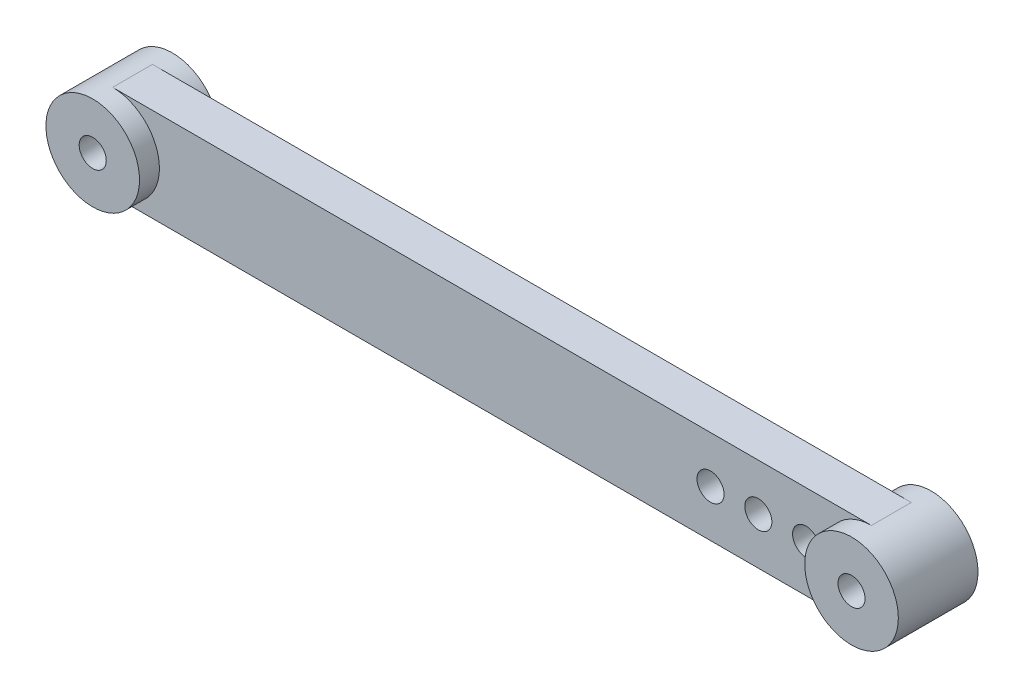
ISO-10303-21;
HEADER;
FILE_DESCRIPTION(('STEP AP214'),'2;1');
FILE_NAME('part.step','',(''),(''),'','','');
FILE_SCHEMA(('AUTOMOTIVE_DESIGN { 1 0 10303 214 1 1 1 1 }'));
ENDSEC;
DATA;
#1=APPLICATION_CONTEXT('core data for automotive mechanical design processes');
#2=APPLICATION_PROTOCOL_DEFINITION('international standard','automotive_design',2000,#1);
#3=PRODUCT_CONTEXT('',#1,'mechanical');
#4=PRODUCT('Part','Part','',(#3));
#5=PRODUCT_RELATED_PRODUCT_CATEGORY('part','',(#4));
#6=PRODUCT_DEFINITION_FORMATION('','',#4);
#7=PRODUCT_DEFINITION_CONTEXT('part definition',#1,'design');
#8=PRODUCT_DEFINITION('design','',#6,#7);
#9=PRODUCT_DEFINITION_SHAPE('','',#8);
#10=(LENGTH_UNIT() NAMED_UNIT(*) SI_UNIT(.MILLI.,.METRE.));
#11=(NAMED_UNIT(*) PLANE_ANGLE_UNIT() SI_UNIT($,.RADIAN.));
#12=(NAMED_UNIT(*) SI_UNIT($,.STERADIAN.) SOLID_ANGLE_UNIT());
#13=UNCERTAINTY_MEASURE_WITH_UNIT(LENGTH_MEASURE(1.E-05),#10,'distance_accuracy_value','');
#14=(GEOMETRIC_REPRESENTATION_CONTEXT(3) GLOBAL_UNCERTAINTY_ASSIGNED_CONTEXT((#13)) GLOBAL_UNIT_ASSIGNED_CONTEXT((#10,
#11,#12)) REPRESENTATION_CONTEXT('',''));
#15=CARTESIAN_POINT('',(0.,0.,0.));
#16=DIRECTION('',(0.,0.,1.));
#17=DIRECTION('',(1.,0.,0.));
#18=AXIS2_PLACEMENT_3D('',#15,#16,#17);
#19=CARTESIAN_POINT('',(-47.625,0.,2.5));
#20=DIRECTION('',(0.,0.,1.));
#21=DIRECTION('',(1.,0.,0.));
#22=AXIS2_PLACEMENT_3D('',#19,#20,#21);
#23=PLANE('',#22);
#24=CARTESIAN_POINT('',(39.425,0.,2.5));
#25=DIRECTION('',(0.,0.,1.));
#26=DIRECTION('',(1.,0.,0.));
#27=AXIS2_PLACEMENT_3D('',#24,#25,#26);
#28=CIRCLE('',#27,1.7);
#29=CARTESIAN_POINT('',(41.125,0.,2.5));
#30=VERTEX_POINT('',#29);
#31=EDGE_CURVE('E134',#30,#30,#28,.T.);
#32=ORIENTED_EDGE('',*,*,#31,.F.);
#33=EDGE_LOOP('',(#32));
#34=FACE_BOUND('',#33,.T.);
#35=CARTESIAN_POINT('',(27.425,0.,2.5));
#36=DIRECTION('',(0.,0.,1.));
#37=DIRECTION('',(1.,0.,0.));
#38=AXIS2_PLACEMENT_3D('',#35,#36,#37);
#39=CIRCLE('',#38,1.7);
#40=CARTESIAN_POINT('',(29.125,0.,2.5));
#41=VERTEX_POINT('',#40);
#42=EDGE_CURVE('E122',#41,#41,#39,.T.);
#43=ORIENTED_EDGE('',*,*,#42,.F.);
#44=EDGE_LOOP('',(#43));
#45=FACE_BOUND('',#44,.T.);
#46=CARTESIAN_POINT('',(33.425,0.,2.5));
#47=DIRECTION('',(0.,0.,1.));
#48=DIRECTION('',(1.,0.,0.));
#49=AXIS2_PLACEMENT_3D('',#46,#47,#48);
#50=CIRCLE('',#49,1.7);
#51=CARTESIAN_POINT('',(35.125,0.,2.5));
#52=VERTEX_POINT('',#51);
#53=EDGE_CURVE('E118',#52,#52,#50,.T.);
#54=ORIENTED_EDGE('',*,*,#53,.F.);
#55=EDGE_LOOP('',(#54));
#56=FACE_BOUND('',#55,.T.);
#57=DIRECTION('',(1.,0.,0.));
#58=VECTOR('',#57,1.);
#59=CARTESIAN_POINT('',(-47.625,-5.875,2.5));
#60=LINE('',#59,#58);
#61=CARTESIAN_POINT('',(-47.625,-5.875,2.5));
#62=VERTEX_POINT('',#61);
#63=CARTESIAN_POINT('',(47.625,-5.87499999999998,2.5));
#64=VERTEX_POINT('',#63);
#65=EDGE_CURVE('E58',#62,#64,#60,.T.);
#66=ORIENTED_EDGE('',*,*,#65,.T.);
#67=CARTESIAN_POINT('',(47.625,0.,2.5));
#68=DIRECTION('',(0.,0.,1.));
#69=DIRECTION('',(1.,0.,0.));
#70=AXIS2_PLACEMENT_3D('',#67,#68,#69);
#71=CIRCLE('',#70,5.875);
#72=CARTESIAN_POINT('',(47.625,5.87500000000002,2.5));
#73=VERTEX_POINT('',#72);
#74=EDGE_CURVE('E102',#64,#73,#71,.F.);
#75=ORIENTED_EDGE('',*,*,#74,.T.);
#76=DIRECTION('',(-1.,0.,0.));
#77=VECTOR('',#76,1.);
#78=CARTESIAN_POINT('',(-47.625,5.875,2.5));
#79=LINE('',#78,#77);
#80=CARTESIAN_POINT('',(-47.625,5.875,2.5));
#81=VERTEX_POINT('',#80);
#82=EDGE_CURVE('E176',#73,#81,#79,.T.);
#83=ORIENTED_EDGE('',*,*,#82,.T.);
#84=CARTESIAN_POINT('',(-47.625,0.,2.5));
#85=DIRECTION('',(0.,0.,1.));
#86=DIRECTION('',(1.,0.,0.));
#87=AXIS2_PLACEMENT_3D('',#84,#85,#86);
#88=CIRCLE('',#87,5.875);
#89=EDGE_CURVE('E75',#81,#62,#88,.F.);
#90=ORIENTED_EDGE('',*,*,#89,.T.);
#91=EDGE_LOOP('',(#66,#75,#83,#90));
#92=FACE_BOUND('',#91,.T.);
#93=ADVANCED_FACE('F38',(#34,#45,#56,#92),#23,.T.);
#94=CARTESIAN_POINT('',(-47.625,0.,-2.5));
#95=DIRECTION('',(0.,0.,1.));
#96=DIRECTION('',(1.,0.,0.));
#97=AXIS2_PLACEMENT_3D('',#94,#95,#96);
#98=PLANE('',#97);
#99=CARTESIAN_POINT('',(39.425,0.,-2.5));
#100=DIRECTION('',(0.,0.,1.));
#101=DIRECTION('',(1.,0.,0.));
#102=AXIS2_PLACEMENT_3D('',#99,#100,#101);
#103=CIRCLE('',#102,1.7);
#104=CARTESIAN_POINT('',(41.125,0.,-2.5));
#105=VERTEX_POINT('',#104);
#106=EDGE_CURVE('E42',#105,#105,#103,.T.);
#107=ORIENTED_EDGE('',*,*,#106,.T.);
#108=EDGE_LOOP('',(#107));
#109=FACE_BOUND('',#108,.T.);
#110=CARTESIAN_POINT('',(27.425,0.,-2.5));
#111=DIRECTION('',(0.,0.,1.));
#112=DIRECTION('',(1.,0.,0.));
#113=AXIS2_PLACEMENT_3D('',#110,#111,#112);
#114=CIRCLE('',#113,1.7);
#115=CARTESIAN_POINT('',(29.125,0.,-2.5));
#116=VERTEX_POINT('',#115);
#117=EDGE_CURVE('E119',#116,#116,#114,.T.);
#118=ORIENTED_EDGE('',*,*,#117,.T.);
#119=EDGE_LOOP('',(#118));
#120=FACE_BOUND('',#119,.T.);
#121=CARTESIAN_POINT('',(33.425,0.,-2.5));
#122=DIRECTION('',(0.,0.,1.));
#123=DIRECTION('',(1.,0.,0.));
#124=AXIS2_PLACEMENT_3D('',#121,#122,#123);
#125=CIRCLE('',#124,1.7);
#126=CARTESIAN_POINT('',(35.125,0.,-2.5));
#127=VERTEX_POINT('',#126);
#128=EDGE_CURVE('E115',#127,#127,#125,.T.);
#129=ORIENTED_EDGE('',*,*,#128,.T.);
#130=EDGE_LOOP('',(#129));
#131=FACE_BOUND('',#130,.T.);
#132=CARTESIAN_POINT('',(47.625,0.,-2.5));
#133=DIRECTION('',(0.,0.,1.));
#134=DIRECTION('',(1.,0.,0.));
#135=AXIS2_PLACEMENT_3D('',#132,#133,#134);
#136=CIRCLE('',#135,5.875);
#137=CARTESIAN_POINT('',(47.625,-5.87499999999998,-2.5));
#138=VERTEX_POINT('',#137);
#139=CARTESIAN_POINT('',(47.625,5.87500000000002,-2.5));
#140=VERTEX_POINT('',#139);
#141=EDGE_CURVE('E11',#138,#140,#136,.F.);
#142=ORIENTED_EDGE('',*,*,#141,.F.);
#143=DIRECTION('',(1.,0.,0.));
#144=VECTOR('',#143,1.);
#145=CARTESIAN_POINT('',(-47.625,-5.875,-2.5));
#146=LINE('',#145,#144);
#147=CARTESIAN_POINT('',(-47.625,-5.875,-2.5));
#148=VERTEX_POINT('',#147);
#149=EDGE_CURVE('E89',#148,#138,#146,.T.);
#150=ORIENTED_EDGE('',*,*,#149,.F.);
#151=CARTESIAN_POINT('',(-47.625,0.,-2.5));
#152=DIRECTION('',(0.,0.,1.));
#153=DIRECTION('',(1.,0.,0.));
#154=AXIS2_PLACEMENT_3D('',#151,#152,#153);
#155=CIRCLE('',#154,5.875);
#156=CARTESIAN_POINT('',(-47.625,5.875,-2.5));
#157=VERTEX_POINT('',#156);
#158=EDGE_CURVE('E49',#157,#148,#155,.F.);
#159=ORIENTED_EDGE('',*,*,#158,.F.);
#160=DIRECTION('',(-1.,0.,0.));
#161=VECTOR('',#160,1.);
#162=CARTESIAN_POINT('',(-47.625,5.875,-2.5));
#163=LINE('',#162,#161);
#164=EDGE_CURVE('E92',#140,#157,#163,.T.);
#165=ORIENTED_EDGE('',*,*,#164,.F.);
#166=EDGE_LOOP('',(#142,#150,#159,#165));
#167=FACE_BOUND('',#166,.T.);
#168=ADVANCED_FACE('F88',(#109,#120,#131,#167),#98,.F.);
#169=CARTESIAN_POINT('',(-47.625,0.,2.5));
#170=DIRECTION('',(0.,0.,-1.));
#171=DIRECTION('',(-1.,0.,0.));
#172=AXIS2_PLACEMENT_3D('',#169,#170,#171);
#173=CYLINDRICAL_SURFACE('',#172,5.875);
#174=DIRECTION('',(0.,0.,-1.));
#175=VECTOR('',#174,1.);
#176=CARTESIAN_POINT('',(-47.625,5.875,2.5));
#177=LINE('',#176,#175);
#178=EDGE_CURVE('E109',#81,#157,#177,.T.);
#179=ORIENTED_EDGE('',*,*,#178,.T.);
#180=ORIENTED_EDGE('',*,*,#158,.T.);
#181=DIRECTION('',(0.,0.,-1.));
#182=VECTOR('',#181,1.);
#183=CARTESIAN_POINT('',(-47.625,-5.875,2.5));
#184=LINE('',#183,#182);
#185=EDGE_CURVE('E97',#62,#148,#184,.T.);
#186=ORIENTED_EDGE('',*,*,#185,.F.);
#187=ORIENTED_EDGE('',*,*,#89,.F.);
#188=EDGE_LOOP('',(#179,#180,#186,#187));
#189=FACE_BOUND('',#188,.T.);
#190=CARTESIAN_POINT('',(-47.625,0.,-5.));
#191=DIRECTION('',(0.,0.,1.));
#192=DIRECTION('',(1.,0.,0.));
#193=AXIS2_PLACEMENT_3D('',#190,#191,#192);
#194=CIRCLE('',#193,5.875);
#195=CARTESIAN_POINT('',(-41.75,0.,-5.));
#196=VERTEX_POINT('',#195);
#197=EDGE_CURVE('E164',#196,#196,#194,.T.);
#198=ORIENTED_EDGE('',*,*,#197,.T.);
#199=EDGE_LOOP('',(#198));
#200=FACE_BOUND('',#199,.T.);
#201=CARTESIAN_POINT('',(-47.625,0.,5.));
#202=DIRECTION('',(0.,0.,1.));
#203=DIRECTION('',(1.,0.,0.));
#204=AXIS2_PLACEMENT_3D('',#201,#202,#203);
#205=CIRCLE('',#204,5.875);
#206=CARTESIAN_POINT('',(-41.75,0.,5.));
#207=VERTEX_POINT('',#206);
#208=EDGE_CURVE('E165',#207,#207,#205,.T.);
#209=ORIENTED_EDGE('',*,*,#208,.F.);
#210=EDGE_LOOP('',(#209));
#211=FACE_BOUND('',#210,.T.);
#212=ADVANCED_FACE('F40',(#189,#200,#211),#173,.T.);
#213=CARTESIAN_POINT('',(-47.625,-5.875,2.5));
#214=DIRECTION('',(0.,1.,0.));
#215=DIRECTION('',(-1.,0.,0.));
#216=AXIS2_PLACEMENT_3D('',#213,#214,#215);
#217=PLANE('',#216);
#218=ORIENTED_EDGE('',*,*,#149,.T.);
#219=DIRECTION('',(0.,0.,-1.));
#220=VECTOR('',#219,1.);
#221=CARTESIAN_POINT('',(47.625,-5.87499999999998,2.5));
#222=LINE('',#221,#220);
#223=EDGE_CURVE('E95',#64,#138,#222,.T.);
#224=ORIENTED_EDGE('',*,*,#223,.F.);
#225=ORIENTED_EDGE('',*,*,#65,.F.);
#226=ORIENTED_EDGE('',*,*,#185,.T.);
#227=EDGE_LOOP('',(#218,#224,#225,#226));
#228=FACE_BOUND('',#227,.T.);
#229=ADVANCED_FACE('F94',(#228),#217,.F.);
#230=CARTESIAN_POINT('',(47.625,0.,2.5));
#231=DIRECTION('',(0.,0.,-1.));
#232=DIRECTION('',(-1.,0.,0.));
#233=AXIS2_PLACEMENT_3D('',#230,#231,#232);
#234=CYLINDRICAL_SURFACE('',#233,5.875);
#235=ORIENTED_EDGE('',*,*,#223,.T.);
#236=ORIENTED_EDGE('',*,*,#141,.T.);
#237=DIRECTION('',(0.,0.,-1.));
#238=VECTOR('',#237,1.);
#239=CARTESIAN_POINT('',(47.625,5.87500000000002,2.5));
#240=LINE('',#239,#238);
#241=EDGE_CURVE('E104',#73,#140,#240,.T.);
#242=ORIENTED_EDGE('',*,*,#241,.F.);
#243=ORIENTED_EDGE('',*,*,#74,.F.);
#244=EDGE_LOOP('',(#235,#236,#242,#243));
#245=FACE_BOUND('',#244,.T.);
#246=CARTESIAN_POINT('',(47.625,0.,-5.));
#247=DIRECTION('',(0.,0.,1.));
#248=DIRECTION('',(1.,0.,0.));
#249=AXIS2_PLACEMENT_3D('',#246,#247,#248);
#250=CIRCLE('',#249,5.875);
#251=CARTESIAN_POINT('',(53.5,0.,-5.));
#252=VERTEX_POINT('',#251);
#253=EDGE_CURVE('E148',#252,#252,#250,.T.);
#254=ORIENTED_EDGE('',*,*,#253,.T.);
#255=EDGE_LOOP('',(#254));
#256=FACE_BOUND('',#255,.T.);
#257=CARTESIAN_POINT('',(47.625,0.,5.));
#258=DIRECTION('',(0.,0.,1.));
#259=DIRECTION('',(1.,0.,0.));
#260=AXIS2_PLACEMENT_3D('',#257,#258,#259);
#261=CIRCLE('',#260,5.875);
#262=CARTESIAN_POINT('',(53.5,0.,5.));
#263=VERTEX_POINT('',#262);
#264=EDGE_CURVE('E155',#263,#263,#261,.T.);
#265=ORIENTED_EDGE('',*,*,#264,.F.);
#266=EDGE_LOOP('',(#265));
#267=FACE_BOUND('',#266,.T.);
#268=ADVANCED_FACE('F100',(#245,#256,#267),#234,.T.);
#269=CARTESIAN_POINT('',(-47.625,5.875,2.5));
#270=DIRECTION('',(0.,-1.,0.));
#271=DIRECTION('',(1.,0.,0.));
#272=AXIS2_PLACEMENT_3D('',#269,#270,#271);
#273=PLANE('',#272);
#274=ORIENTED_EDGE('',*,*,#164,.T.);
#275=ORIENTED_EDGE('',*,*,#178,.F.);
#276=ORIENTED_EDGE('',*,*,#82,.F.);
#277=ORIENTED_EDGE('',*,*,#241,.T.);
#278=EDGE_LOOP('',(#274,#275,#276,#277));
#279=FACE_BOUND('',#278,.T.);
#280=ADVANCED_FACE('F184',(#279),#273,.F.);
#281=CARTESIAN_POINT('',(-47.625,0.,-5.));
#282=DIRECTION('',(0.,0.,1.));
#283=DIRECTION('',(1.,0.,0.));
#284=AXIS2_PLACEMENT_3D('',#281,#282,#283);
#285=PLANE('',#284);
#286=CARTESIAN_POINT('',(-47.625,0.,-5.));
#287=DIRECTION('',(0.,0.,1.));
#288=DIRECTION('',(1.,0.,0.));
#289=AXIS2_PLACEMENT_3D('',#286,#287,#288);
#290=CIRCLE('',#289,1.7);
#291=CARTESIAN_POINT('',(-45.925,0.,-5.));
#292=VERTEX_POINT('',#291);
#293=EDGE_CURVE('E143',#292,#292,#290,.T.);
#294=ORIENTED_EDGE('',*,*,#293,.T.);
#295=EDGE_LOOP('',(#294));
#296=FACE_BOUND('',#295,.T.);
#297=ORIENTED_EDGE('',*,*,#197,.F.);
#298=EDGE_LOOP('',(#297));
#299=FACE_BOUND('',#298,.T.);
#300=ADVANCED_FACE('F197',(#296,#299),#285,.F.);
#301=CARTESIAN_POINT('',(-47.625,0.,5.));
#302=DIRECTION('',(0.,0.,1.));
#303=DIRECTION('',(1.,0.,0.));
#304=AXIS2_PLACEMENT_3D('',#301,#302,#303);
#305=PLANE('',#304);
#306=CARTESIAN_POINT('',(-47.625,0.,5.));
#307=DIRECTION('',(0.,0.,1.));
#308=DIRECTION('',(1.,0.,0.));
#309=AXIS2_PLACEMENT_3D('',#306,#307,#308);
#310=CIRCLE('',#309,1.7);
#311=CARTESIAN_POINT('',(-45.925,0.,5.));
#312=VERTEX_POINT('',#311);
#313=EDGE_CURVE('E139',#312,#312,#310,.T.);
#314=ORIENTED_EDGE('',*,*,#313,.F.);
#315=EDGE_LOOP('',(#314));
#316=FACE_BOUND('',#315,.T.);
#317=ORIENTED_EDGE('',*,*,#208,.T.);
#318=EDGE_LOOP('',(#317));
#319=FACE_BOUND('',#318,.T.);
#320=ADVANCED_FACE('F244',(#316,#319),#305,.T.);
#321=CARTESIAN_POINT('',(47.625,0.,-5.));
#322=DIRECTION('',(0.,0.,1.));
#323=DIRECTION('',(1.,0.,0.));
#324=AXIS2_PLACEMENT_3D('',#321,#322,#323);
#325=PLANE('',#324);
#326=CARTESIAN_POINT('',(47.625,0.,-5.));
#327=DIRECTION('',(0.,0.,1.));
#328=DIRECTION('',(1.,0.,0.));
#329=AXIS2_PLACEMENT_3D('',#326,#327,#328);
#330=CIRCLE('',#329,1.7);
#331=CARTESIAN_POINT('',(49.325,0.,-5.));
#332=VERTEX_POINT('',#331);
#333=EDGE_CURVE('E144',#332,#332,#330,.T.);
#334=ORIENTED_EDGE('',*,*,#333,.T.);
#335=EDGE_LOOP('',(#334));
#336=FACE_BOUND('',#335,.T.);
#337=ORIENTED_EDGE('',*,*,#253,.F.);
#338=EDGE_LOOP('',(#337));
#339=FACE_BOUND('',#338,.T.);
#340=ADVANCED_FACE('F252',(#336,#339),#325,.F.);
#341=CARTESIAN_POINT('',(47.625,0.,5.));
#342=DIRECTION('',(0.,0.,1.));
#343=DIRECTION('',(1.,0.,0.));
#344=AXIS2_PLACEMENT_3D('',#341,#342,#343);
#345=PLANE('',#344);
#346=CARTESIAN_POINT('',(47.625,0.,5.));
#347=DIRECTION('',(0.,0.,1.));
#348=DIRECTION('',(1.,0.,0.));
#349=AXIS2_PLACEMENT_3D('',#346,#347,#348);
#350=CIRCLE('',#349,1.7);
#351=CARTESIAN_POINT('',(49.325,0.,5.));
#352=VERTEX_POINT('',#351);
#353=EDGE_CURVE('E138',#352,#352,#350,.T.);
#354=ORIENTED_EDGE('',*,*,#353,.F.);
#355=EDGE_LOOP('',(#354));
#356=FACE_BOUND('',#355,.T.);
#357=ORIENTED_EDGE('',*,*,#264,.T.);
#358=EDGE_LOOP('',(#357));
#359=FACE_BOUND('',#358,.T.);
#360=ADVANCED_FACE('F260',(#356,#359),#345,.T.);
#361=CARTESIAN_POINT('',(47.625,0.,-5.));
#362=DIRECTION('',(0.,0.,1.));
#363=DIRECTION('',(1.,0.,0.));
#364=AXIS2_PLACEMENT_3D('',#361,#362,#363);
#365=CYLINDRICAL_SURFACE('',#364,1.7);
#366=ORIENTED_EDGE('',*,*,#333,.F.);
#367=EDGE_LOOP('',(#366));
#368=FACE_BOUND('',#367,.T.);
#369=ORIENTED_EDGE('',*,*,#353,.T.);
#370=EDGE_LOOP('',(#369));
#371=FACE_BOUND('',#370,.T.);
#372=ADVANCED_FACE('F269',(#368,#371),#365,.F.);
#373=CARTESIAN_POINT('',(-47.625,0.,-5.));
#374=DIRECTION('',(0.,0.,1.));
#375=DIRECTION('',(1.,0.,0.));
#376=AXIS2_PLACEMENT_3D('',#373,#374,#375);
#377=CYLINDRICAL_SURFACE('',#376,1.7);
#378=ORIENTED_EDGE('',*,*,#293,.F.);
#379=EDGE_LOOP('',(#378));
#380=FACE_BOUND('',#379,.T.);
#381=ORIENTED_EDGE('',*,*,#313,.T.);
#382=EDGE_LOOP('',(#381));
#383=FACE_BOUND('',#382,.T.);
#384=ADVANCED_FACE('F278',(#380,#383),#377,.F.);
#385=CARTESIAN_POINT('',(33.425,0.,-5.));
#386=DIRECTION('',(0.,0.,1.));
#387=DIRECTION('',(1.,0.,0.));
#388=AXIS2_PLACEMENT_3D('',#385,#386,#387);
#389=CYLINDRICAL_SURFACE('',#388,1.7);
#390=ORIENTED_EDGE('',*,*,#53,.T.);
#391=EDGE_LOOP('',(#390));
#392=FACE_BOUND('',#391,.T.);
#393=ORIENTED_EDGE('',*,*,#128,.F.);
#394=EDGE_LOOP('',(#393));
#395=FACE_BOUND('',#394,.T.);
#396=ADVANCED_FACE('F286',(#392,#395),#389,.F.);
#397=CARTESIAN_POINT('',(27.425,0.,-5.));
#398=DIRECTION('',(0.,0.,1.));
#399=DIRECTION('',(1.,0.,0.));
#400=AXIS2_PLACEMENT_3D('',#397,#398,#399);
#401=CYLINDRICAL_SURFACE('',#400,1.7);
#402=ORIENTED_EDGE('',*,*,#42,.T.);
#403=EDGE_LOOP('',(#402));
#404=FACE_BOUND('',#403,.T.);
#405=ORIENTED_EDGE('',*,*,#117,.F.);
#406=EDGE_LOOP('',(#405));
#407=FACE_BOUND('',#406,.T.);
#408=ADVANCED_FACE('F294',(#404,#407),#401,.F.);
#409=CARTESIAN_POINT('',(39.425,0.,-5.));
#410=DIRECTION('',(0.,0.,1.));
#411=DIRECTION('',(1.,0.,0.));
#412=AXIS2_PLACEMENT_3D('',#409,#410,#411);
#413=CYLINDRICAL_SURFACE('',#412,1.7);
#414=ORIENTED_EDGE('',*,*,#31,.T.);
#415=EDGE_LOOP('',(#414));
#416=FACE_BOUND('',#415,.T.);
#417=ORIENTED_EDGE('',*,*,#106,.F.);
#418=EDGE_LOOP('',(#417));
#419=FACE_BOUND('',#418,.T.);
#420=ADVANCED_FACE('F302',(#416,#419),#413,.F.);
#421=CLOSED_SHELL('',(#93,#168,#212,#229,#268,#280,#300,#320,#340,#360,#372,#384,#396,#408,#420));
#422=MANIFOLD_SOLID_BREP('B2',#421);
#423=ADVANCED_BREP_SHAPE_REPRESENTATION('',(#18,#422),#14);
#424=SHAPE_DEFINITION_REPRESENTATION(#9,#423);
ENDSEC;
END-ISO-10303-21;
